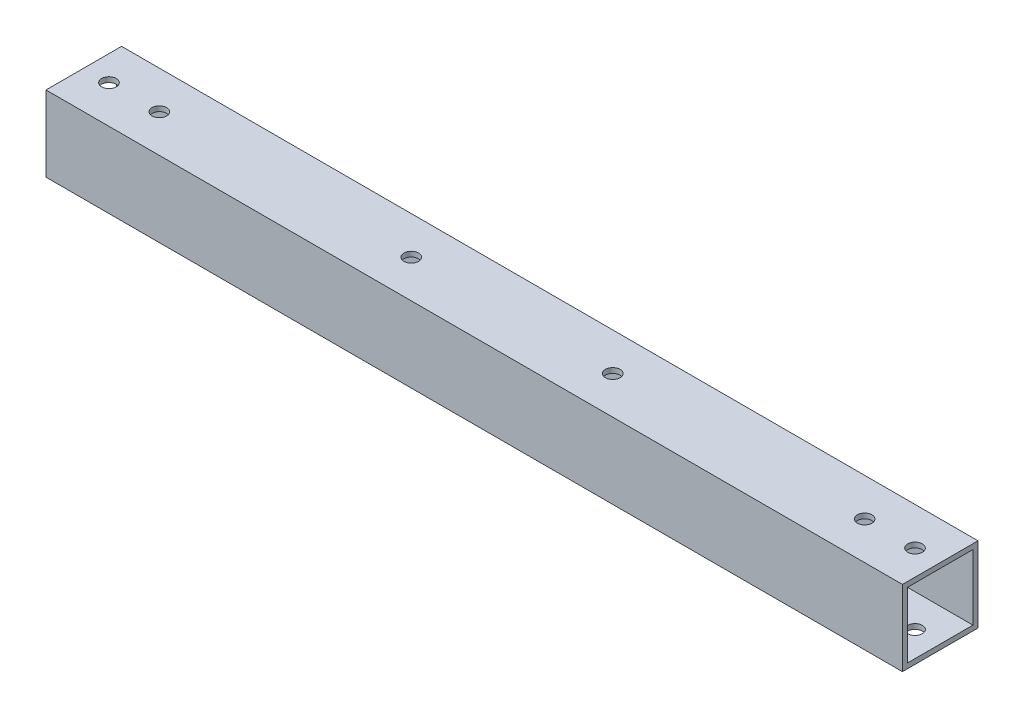
ISO-10303-21;
HEADER;
FILE_DESCRIPTION(('STEP AP214'),'2;1');
FILE_NAME('part.step','',(''),(''),'','','');
FILE_SCHEMA(('AUTOMOTIVE_DESIGN { 1 0 10303 214 1 1 1 1 }'));
ENDSEC;
DATA;
#1=APPLICATION_CONTEXT('core data for automotive mechanical design processes');
#2=APPLICATION_PROTOCOL_DEFINITION('international standard','automotive_design',2000,#1);
#3=PRODUCT_CONTEXT('',#1,'mechanical');
#4=PRODUCT('Part','Part','',(#3));
#5=PRODUCT_RELATED_PRODUCT_CATEGORY('part','',(#4));
#6=PRODUCT_DEFINITION_FORMATION('','',#4);
#7=PRODUCT_DEFINITION_CONTEXT('part definition',#1,'design');
#8=PRODUCT_DEFINITION('design','',#6,#7);
#9=PRODUCT_DEFINITION_SHAPE('','',#8);
#10=(LENGTH_UNIT() NAMED_UNIT(*) SI_UNIT(.MILLI.,.METRE.));
#11=(NAMED_UNIT(*) PLANE_ANGLE_UNIT() SI_UNIT($,.RADIAN.));
#12=(NAMED_UNIT(*) SI_UNIT($,.STERADIAN.) SOLID_ANGLE_UNIT());
#13=UNCERTAINTY_MEASURE_WITH_UNIT(LENGTH_MEASURE(1.E-05),#10,'distance_accuracy_value','');
#14=(GEOMETRIC_REPRESENTATION_CONTEXT(3) GLOBAL_UNCERTAINTY_ASSIGNED_CONTEXT((#13)) GLOBAL_UNIT_ASSIGNED_CONTEXT((#10,
#11,#12)) REPRESENTATION_CONTEXT('',''));
#15=CARTESIAN_POINT('',(0.,0.,0.));
#16=DIRECTION('',(0.,0.,1.));
#17=DIRECTION('',(1.,0.,0.));
#18=AXIS2_PLACEMENT_3D('',#15,#16,#17);
#19=CARTESIAN_POINT('',(85.,-6.50000000000001,-6.49999999999999));
#20=DIRECTION('',(0.,0.,1.));
#21=DIRECTION('',(1.,0.,0.));
#22=AXIS2_PLACEMENT_3D('',#19,#20,#21);
#23=PLANE('',#22);
#24=DIRECTION('',(0.,1.,0.));
#25=VECTOR('',#24,1.);
#26=CARTESIAN_POINT('',(-85.,-6.50000000000001,-6.49999999999999));
#27=LINE('',#26,#25);
#28=CARTESIAN_POINT('',(-85.,-6.50000000000001,-6.49999999999999));
#29=VERTEX_POINT('',#28);
#30=CARTESIAN_POINT('',(-85.,6.49999999999999,-6.49999999999999));
#31=VERTEX_POINT('',#30);
#32=EDGE_CURVE('E164',#29,#31,#27,.T.);
#33=ORIENTED_EDGE('',*,*,#32,.F.);
#34=DIRECTION('',(-1.,0.,0.));
#35=VECTOR('',#34,1.);
#36=CARTESIAN_POINT('',(85.,-6.50000000000001,-6.49999999999999));
#37=LINE('',#36,#35);
#38=CARTESIAN_POINT('',(85.,-6.50000000000001,-6.49999999999999));
#39=VERTEX_POINT('',#38);
#40=EDGE_CURVE('E12',#39,#29,#37,.T.);
#41=ORIENTED_EDGE('',*,*,#40,.F.);
#42=DIRECTION('',(0.,1.,0.));
#43=VECTOR('',#42,1.);
#44=CARTESIAN_POINT('',(85.,-6.50000000000001,-6.49999999999999));
#45=LINE('',#44,#43);
#46=CARTESIAN_POINT('',(85.,6.49999999999999,-6.49999999999999));
#47=VERTEX_POINT('',#46);
#48=EDGE_CURVE('E145',#39,#47,#45,.T.);
#49=ORIENTED_EDGE('',*,*,#48,.T.);
#50=DIRECTION('',(-1.,0.,0.));
#51=VECTOR('',#50,1.);
#52=CARTESIAN_POINT('',(85.,6.49999999999999,-6.49999999999999));
#53=LINE('',#52,#51);
#54=EDGE_CURVE('E76',#47,#31,#53,.T.);
#55=ORIENTED_EDGE('',*,*,#54,.T.);
#56=EDGE_LOOP('',(#33,#41,#49,#55));
#57=FACE_BOUND('',#56,.T.);
#58=ADVANCED_FACE('F57',(#57),#23,.T.);
#59=CARTESIAN_POINT('',(85.,-6.50000000000001,6.50000000000001));
#60=DIRECTION('',(0.,1.,0.));
#61=DIRECTION('',(0.,0.,1.));
#62=AXIS2_PLACEMENT_3D('',#59,#60,#61);
#63=PLANE('',#62);
#64=CARTESIAN_POINT('',(-20.,-6.50000000000001,0.));
#65=DIRECTION('',(0.,1.,0.));
#66=DIRECTION('',(0.,0.,1.));
#67=AXIS2_PLACEMENT_3D('',#64,#65,#66);
#68=CIRCLE('',#67,1.45);
#69=CARTESIAN_POINT('',(-20.,-6.50000000000001,1.45));
#70=VERTEX_POINT('',#69);
#71=EDGE_CURVE('E222',#70,#70,#68,.T.);
#72=ORIENTED_EDGE('',*,*,#71,.F.);
#73=EDGE_LOOP('',(#72));
#74=FACE_BOUND('',#73,.T.);
#75=CARTESIAN_POINT('',(20.,-6.50000000000001,0.));
#76=DIRECTION('',(0.,1.,0.));
#77=DIRECTION('',(0.,0.,1.));
#78=AXIS2_PLACEMENT_3D('',#75,#76,#77);
#79=CIRCLE('',#78,1.45);
#80=CARTESIAN_POINT('',(20.,-6.50000000000001,1.45));
#81=VERTEX_POINT('',#80);
#82=EDGE_CURVE('E202',#81,#81,#79,.T.);
#83=ORIENTED_EDGE('',*,*,#82,.F.);
#84=EDGE_LOOP('',(#83));
#85=FACE_BOUND('',#84,.T.);
#86=CARTESIAN_POINT('',(-80.,-6.50000000000001,0.));
#87=DIRECTION('',(0.,1.,0.));
#88=DIRECTION('',(0.,0.,1.));
#89=AXIS2_PLACEMENT_3D('',#86,#87,#88);
#90=CIRCLE('',#89,1.45);
#91=CARTESIAN_POINT('',(-80.,-6.50000000000001,1.45));
#92=VERTEX_POINT('',#91);
#93=EDGE_CURVE('E158',#92,#92,#90,.T.);
#94=ORIENTED_EDGE('',*,*,#93,.F.);
#95=EDGE_LOOP('',(#94));
#96=FACE_BOUND('',#95,.T.);
#97=CARTESIAN_POINT('',(-70.,-6.50000000000001,0.));
#98=DIRECTION('',(0.,1.,0.));
#99=DIRECTION('',(0.,0.,1.));
#100=AXIS2_PLACEMENT_3D('',#97,#98,#99);
#101=CIRCLE('',#100,1.45);
#102=CARTESIAN_POINT('',(-70.,-6.50000000000001,1.45));
#103=VERTEX_POINT('',#102);
#104=EDGE_CURVE('E197',#103,#103,#101,.T.);
#105=ORIENTED_EDGE('',*,*,#104,.F.);
#106=EDGE_LOOP('',(#105));
#107=FACE_BOUND('',#106,.T.);
#108=CARTESIAN_POINT('',(70.,-6.50000000000001,0.));
#109=DIRECTION('',(0.,1.,0.));
#110=DIRECTION('',(0.,0.,1.));
#111=AXIS2_PLACEMENT_3D('',#108,#109,#110);
#112=CIRCLE('',#111,1.45);
#113=CARTESIAN_POINT('',(70.,-6.50000000000001,1.44999999999998));
#114=VERTEX_POINT('',#113);
#115=EDGE_CURVE('E193',#114,#114,#112,.T.);
#116=ORIENTED_EDGE('',*,*,#115,.F.);
#117=EDGE_LOOP('',(#116));
#118=FACE_BOUND('',#117,.T.);
#119=CARTESIAN_POINT('',(80.,-6.50000000000001,0.));
#120=DIRECTION('',(0.,1.,0.));
#121=DIRECTION('',(0.,0.,1.));
#122=AXIS2_PLACEMENT_3D('',#119,#120,#121);
#123=CIRCLE('',#122,1.45);
#124=CARTESIAN_POINT('',(80.,-6.50000000000001,1.44999999999998));
#125=VERTEX_POINT('',#124);
#126=EDGE_CURVE('E188',#125,#125,#123,.T.);
#127=ORIENTED_EDGE('',*,*,#126,.F.);
#128=EDGE_LOOP('',(#127));
#129=FACE_BOUND('',#128,.T.);
#130=DIRECTION('',(0.,0.,-1.));
#131=VECTOR('',#130,1.);
#132=CARTESIAN_POINT('',(-85.,-6.50000000000001,6.50000000000001));
#133=LINE('',#132,#131);
#134=CARTESIAN_POINT('',(-85.,-6.50000000000001,6.50000000000001));
#135=VERTEX_POINT('',#134);
#136=EDGE_CURVE('E134',#135,#29,#133,.T.);
#137=ORIENTED_EDGE('',*,*,#136,.F.);
#138=DIRECTION('',(-1.,0.,0.));
#139=VECTOR('',#138,1.);
#140=CARTESIAN_POINT('',(85.,-6.50000000000001,6.50000000000001));
#141=LINE('',#140,#139);
#142=CARTESIAN_POINT('',(85.,-6.50000000000001,6.50000000000001));
#143=VERTEX_POINT('',#142);
#144=EDGE_CURVE('E67',#143,#135,#141,.T.);
#145=ORIENTED_EDGE('',*,*,#144,.F.);
#146=DIRECTION('',(0.,0.,-1.));
#147=VECTOR('',#146,1.);
#148=CARTESIAN_POINT('',(85.,-6.50000000000001,6.50000000000001));
#149=LINE('',#148,#147);
#150=EDGE_CURVE('E132',#143,#39,#149,.T.);
#151=ORIENTED_EDGE('',*,*,#150,.T.);
#152=ORIENTED_EDGE('',*,*,#40,.T.);
#153=EDGE_LOOP('',(#137,#145,#151,#152));
#154=FACE_BOUND('',#153,.T.);
#155=ADVANCED_FACE('F131',(#74,#85,#96,#107,#118,#129,#154),#63,.T.);
#156=CARTESIAN_POINT('',(85.,-6.50000000000001,6.50000000000001));
#157=DIRECTION('',(0.,0.,-1.));
#158=DIRECTION('',(-1.,0.,0.));
#159=AXIS2_PLACEMENT_3D('',#156,#157,#158);
#160=PLANE('',#159);
#161=DIRECTION('',(0.,-1.,0.));
#162=VECTOR('',#161,1.);
#163=CARTESIAN_POINT('',(-85.,-6.50000000000001,6.50000000000001));
#164=LINE('',#163,#162);
#165=CARTESIAN_POINT('',(-85.,6.49999999999999,6.50000000000001));
#166=VERTEX_POINT('',#165);
#167=EDGE_CURVE('E167',#166,#135,#164,.T.);
#168=ORIENTED_EDGE('',*,*,#167,.F.);
#169=DIRECTION('',(-1.,0.,0.));
#170=VECTOR('',#169,1.);
#171=CARTESIAN_POINT('',(85.,6.49999999999999,6.50000000000001));
#172=LINE('',#171,#170);
#173=CARTESIAN_POINT('',(85.,6.49999999999999,6.50000000000001));
#174=VERTEX_POINT('',#173);
#175=EDGE_CURVE('E101',#174,#166,#172,.T.);
#176=ORIENTED_EDGE('',*,*,#175,.F.);
#177=DIRECTION('',(0.,-1.,0.));
#178=VECTOR('',#177,1.);
#179=CARTESIAN_POINT('',(85.,-6.50000000000001,6.50000000000001));
#180=LINE('',#179,#178);
#181=EDGE_CURVE('E144',#174,#143,#180,.T.);
#182=ORIENTED_EDGE('',*,*,#181,.T.);
#183=ORIENTED_EDGE('',*,*,#144,.T.);
#184=EDGE_LOOP('',(#168,#176,#182,#183));
#185=FACE_BOUND('',#184,.T.);
#186=ADVANCED_FACE('F147',(#185),#160,.T.);
#187=CARTESIAN_POINT('',(85.,-7.50000000000001,-7.49999999999999));
#188=DIRECTION('',(0.,0.,1.));
#189=DIRECTION('',(1.,0.,0.));
#190=AXIS2_PLACEMENT_3D('',#187,#188,#189);
#191=PLANE('',#190);
#192=DIRECTION('',(0.,1.,0.));
#193=VECTOR('',#192,1.);
#194=CARTESIAN_POINT('',(-85.,-7.50000000000001,-7.49999999999999));
#195=LINE('',#194,#193);
#196=CARTESIAN_POINT('',(-85.,-7.50000000000001,-7.49999999999999));
#197=VERTEX_POINT('',#196);
#198=CARTESIAN_POINT('',(-85.,7.49999999999999,-7.49999999999999));
#199=VERTEX_POINT('',#198);
#200=EDGE_CURVE('E154',#197,#199,#195,.T.);
#201=ORIENTED_EDGE('',*,*,#200,.T.);
#202=DIRECTION('',(-1.,0.,0.));
#203=VECTOR('',#202,1.);
#204=CARTESIAN_POINT('',(85.,7.49999999999999,-7.49999999999999));
#205=LINE('',#204,#203);
#206=CARTESIAN_POINT('',(85.,7.49999999999999,-7.49999999999999));
#207=VERTEX_POINT('',#206);
#208=EDGE_CURVE('E174',#207,#199,#205,.T.);
#209=ORIENTED_EDGE('',*,*,#208,.F.);
#210=DIRECTION('',(0.,1.,0.));
#211=VECTOR('',#210,1.);
#212=CARTESIAN_POINT('',(85.,-7.50000000000001,-7.49999999999999));
#213=LINE('',#212,#211);
#214=CARTESIAN_POINT('',(85.,-7.50000000000001,-7.49999999999999));
#215=VERTEX_POINT('',#214);
#216=EDGE_CURVE('E172',#215,#207,#213,.T.);
#217=ORIENTED_EDGE('',*,*,#216,.F.);
#218=DIRECTION('',(-1.,0.,0.));
#219=VECTOR('',#218,1.);
#220=CARTESIAN_POINT('',(85.,-7.50000000000001,-7.49999999999999));
#221=LINE('',#220,#219);
#222=EDGE_CURVE('E150',#215,#197,#221,.T.);
#223=ORIENTED_EDGE('',*,*,#222,.T.);
#224=EDGE_LOOP('',(#201,#209,#217,#223));
#225=FACE_BOUND('',#224,.T.);
#226=ADVANCED_FACE('F59',(#225),#191,.F.);
#227=CARTESIAN_POINT('',(85.,7.49999999999999,7.50000000000001));
#228=DIRECTION('',(0.,-1.,0.));
#229=DIRECTION('',(0.,0.,-1.));
#230=AXIS2_PLACEMENT_3D('',#227,#228,#229);
#231=PLANE('',#230);
#232=CARTESIAN_POINT('',(-20.,7.49999999999999,0.));
#233=DIRECTION('',(0.,1.,0.));
#234=DIRECTION('',(0.,0.,1.));
#235=AXIS2_PLACEMENT_3D('',#232,#233,#234);
#236=CIRCLE('',#235,1.45);
#237=CARTESIAN_POINT('',(-20.,7.49999999999999,1.45));
#238=VERTEX_POINT('',#237);
#239=EDGE_CURVE('E209',#238,#238,#236,.T.);
#240=ORIENTED_EDGE('',*,*,#239,.F.);
#241=EDGE_LOOP('',(#240));
#242=FACE_BOUND('',#241,.T.);
#243=CARTESIAN_POINT('',(20.,7.49999999999999,0.));
#244=DIRECTION('',(0.,1.,0.));
#245=DIRECTION('',(0.,0.,1.));
#246=AXIS2_PLACEMENT_3D('',#243,#244,#245);
#247=CIRCLE('',#246,1.45);
#248=CARTESIAN_POINT('',(20.,7.49999999999999,1.45));
#249=VERTEX_POINT('',#248);
#250=EDGE_CURVE('E214',#249,#249,#247,.T.);
#251=ORIENTED_EDGE('',*,*,#250,.F.);
#252=EDGE_LOOP('',(#251));
#253=FACE_BOUND('',#252,.T.);
#254=CARTESIAN_POINT('',(-80.,7.49999999999999,0.));
#255=DIRECTION('',(0.,1.,0.));
#256=DIRECTION('',(0.,0.,1.));
#257=AXIS2_PLACEMENT_3D('',#254,#255,#256);
#258=CIRCLE('',#257,1.45);
#259=CARTESIAN_POINT('',(-80.,7.49999999999999,1.45));
#260=VERTEX_POINT('',#259);
#261=EDGE_CURVE('E228',#260,#260,#258,.T.);
#262=ORIENTED_EDGE('',*,*,#261,.F.);
#263=EDGE_LOOP('',(#262));
#264=FACE_BOUND('',#263,.T.);
#265=CARTESIAN_POINT('',(-70.,7.49999999999999,0.));
#266=DIRECTION('',(0.,1.,0.));
#267=DIRECTION('',(0.,0.,1.));
#268=AXIS2_PLACEMENT_3D('',#265,#266,#267);
#269=CIRCLE('',#268,1.45);
#270=CARTESIAN_POINT('',(-70.,7.49999999999999,1.45));
#271=VERTEX_POINT('',#270);
#272=EDGE_CURVE('E231',#271,#271,#269,.T.);
#273=ORIENTED_EDGE('',*,*,#272,.F.);
#274=EDGE_LOOP('',(#273));
#275=FACE_BOUND('',#274,.T.);
#276=CARTESIAN_POINT('',(70.,7.49999999999999,0.));
#277=DIRECTION('',(0.,1.,0.));
#278=DIRECTION('',(0.,0.,-1.));
#279=AXIS2_PLACEMENT_3D('',#276,#277,#278);
#280=CIRCLE('',#279,1.45);
#281=CARTESIAN_POINT('',(70.,7.49999999999999,-1.45000000000002));
#282=VERTEX_POINT('',#281);
#283=EDGE_CURVE('E237',#282,#282,#280,.T.);
#284=ORIENTED_EDGE('',*,*,#283,.F.);
#285=EDGE_LOOP('',(#284));
#286=FACE_BOUND('',#285,.T.);
#287=CARTESIAN_POINT('',(80.,7.49999999999999,0.));
#288=DIRECTION('',(0.,1.,0.));
#289=DIRECTION('',(0.,0.,-1.));
#290=AXIS2_PLACEMENT_3D('',#287,#288,#289);
#291=CIRCLE('',#290,1.45);
#292=CARTESIAN_POINT('',(80.,7.49999999999999,-1.45000000000002));
#293=VERTEX_POINT('',#292);
#294=EDGE_CURVE('E243',#293,#293,#291,.T.);
#295=ORIENTED_EDGE('',*,*,#294,.F.);
#296=EDGE_LOOP('',(#295));
#297=FACE_BOUND('',#296,.T.);
#298=DIRECTION('',(0.,0.,1.));
#299=VECTOR('',#298,1.);
#300=CARTESIAN_POINT('',(-85.,7.49999999999999,7.50000000000001));
#301=LINE('',#300,#299);
#302=CARTESIAN_POINT('',(-85.,7.49999999999999,7.50000000000001));
#303=VERTEX_POINT('',#302);
#304=EDGE_CURVE('E157',#199,#303,#301,.T.);
#305=ORIENTED_EDGE('',*,*,#304,.T.);
#306=DIRECTION('',(-1.,0.,0.));
#307=VECTOR('',#306,1.);
#308=CARTESIAN_POINT('',(85.,7.49999999999999,7.50000000000001));
#309=LINE('',#308,#307);
#310=CARTESIAN_POINT('',(85.,7.49999999999999,7.50000000000001));
#311=VERTEX_POINT('',#310);
#312=EDGE_CURVE('E181',#311,#303,#309,.T.);
#313=ORIENTED_EDGE('',*,*,#312,.F.);
#314=DIRECTION('',(0.,0.,1.));
#315=VECTOR('',#314,1.);
#316=CARTESIAN_POINT('',(85.,7.49999999999999,7.50000000000001));
#317=LINE('',#316,#315);
#318=EDGE_CURVE('E114',#207,#311,#317,.T.);
#319=ORIENTED_EDGE('',*,*,#318,.F.);
#320=ORIENTED_EDGE('',*,*,#208,.T.);
#321=EDGE_LOOP('',(#305,#313,#319,#320));
#322=FACE_BOUND('',#321,.T.);
#323=ADVANCED_FACE('F290',(#242,#253,#264,#275,#286,#297,#322),#231,.F.);
#324=CARTESIAN_POINT('',(85.,-7.50000000000001,7.49999999999999));
#325=DIRECTION('',(0.,0.,-1.));
#326=DIRECTION('',(0.,1.,0.));
#327=AXIS2_PLACEMENT_3D('',#324,#325,#326);
#328=PLANE('',#327);
#329=DIRECTION('',(0.,-1.,0.));
#330=VECTOR('',#329,1.);
#331=CARTESIAN_POINT('',(-85.,-7.50000000000001,7.49999999999999));
#332=LINE('',#331,#330);
#333=CARTESIAN_POINT('',(-85.,-7.50000000000001,7.49999999999999));
#334=VERTEX_POINT('',#333);
#335=EDGE_CURVE('E160',#303,#334,#332,.T.);
#336=ORIENTED_EDGE('',*,*,#335,.T.);
#337=DIRECTION('',(-1.,0.,0.));
#338=VECTOR('',#337,1.);
#339=CARTESIAN_POINT('',(85.,-7.50000000000001,7.49999999999999));
#340=LINE('',#339,#338);
#341=CARTESIAN_POINT('',(85.,-7.50000000000001,7.49999999999999));
#342=VERTEX_POINT('',#341);
#343=EDGE_CURVE('E178',#342,#334,#340,.T.);
#344=ORIENTED_EDGE('',*,*,#343,.F.);
#345=DIRECTION('',(0.,-1.,0.));
#346=VECTOR('',#345,1.);
#347=CARTESIAN_POINT('',(85.,-7.50000000000001,7.49999999999999));
#348=LINE('',#347,#346);
#349=EDGE_CURVE('E258',#311,#342,#348,.T.);
#350=ORIENTED_EDGE('',*,*,#349,.F.);
#351=ORIENTED_EDGE('',*,*,#312,.T.);
#352=EDGE_LOOP('',(#336,#344,#350,#351));
#353=FACE_BOUND('',#352,.T.);
#354=ADVANCED_FACE('F274',(#353),#328,.F.);
#355=CARTESIAN_POINT('',(85.,-7.50000000000001,7.49999999999999));
#356=DIRECTION('',(0.,1.,0.));
#357=DIRECTION('',(0.,0.,1.));
#358=AXIS2_PLACEMENT_3D('',#355,#356,#357);
#359=PLANE('',#358);
#360=CARTESIAN_POINT('',(-20.,-7.50000000000001,0.));
#361=DIRECTION('',(0.,1.,0.));
#362=DIRECTION('',(0.,0.,1.));
#363=AXIS2_PLACEMENT_3D('',#360,#361,#362);
#364=CIRCLE('',#363,1.45);
#365=CARTESIAN_POINT('',(-20.,-7.50000000000001,1.45));
#366=VERTEX_POINT('',#365);
#367=EDGE_CURVE('E203',#366,#366,#364,.T.);
#368=ORIENTED_EDGE('',*,*,#367,.T.);
#369=EDGE_LOOP('',(#368));
#370=FACE_BOUND('',#369,.T.);
#371=CARTESIAN_POINT('',(20.,-7.50000000000001,0.));
#372=DIRECTION('',(0.,1.,0.));
#373=DIRECTION('',(0.,0.,1.));
#374=AXIS2_PLACEMENT_3D('',#371,#372,#373);
#375=CIRCLE('',#374,1.45);
#376=CARTESIAN_POINT('',(20.,-7.50000000000001,1.45));
#377=VERTEX_POINT('',#376);
#378=EDGE_CURVE('E219',#377,#377,#375,.T.);
#379=ORIENTED_EDGE('',*,*,#378,.T.);
#380=EDGE_LOOP('',(#379));
#381=FACE_BOUND('',#380,.T.);
#382=CARTESIAN_POINT('',(-80.,-7.50000000000001,0.));
#383=DIRECTION('',(0.,1.,0.));
#384=DIRECTION('',(0.,0.,1.));
#385=AXIS2_PLACEMENT_3D('',#382,#383,#384);
#386=CIRCLE('',#385,1.45);
#387=CARTESIAN_POINT('',(-80.,-7.50000000000001,1.45));
#388=VERTEX_POINT('',#387);
#389=EDGE_CURVE('E189',#388,#388,#386,.T.);
#390=ORIENTED_EDGE('',*,*,#389,.T.);
#391=EDGE_LOOP('',(#390));
#392=FACE_BOUND('',#391,.T.);
#393=CARTESIAN_POINT('',(-70.,-7.50000000000001,0.));
#394=DIRECTION('',(0.,1.,0.));
#395=DIRECTION('',(0.,0.,1.));
#396=AXIS2_PLACEMENT_3D('',#393,#394,#395);
#397=CIRCLE('',#396,1.45);
#398=CARTESIAN_POINT('',(-70.,-7.50000000000001,1.45));
#399=VERTEX_POINT('',#398);
#400=EDGE_CURVE('E234',#399,#399,#397,.T.);
#401=ORIENTED_EDGE('',*,*,#400,.T.);
#402=EDGE_LOOP('',(#401));
#403=FACE_BOUND('',#402,.T.);
#404=CARTESIAN_POINT('',(70.,-7.50000000000001,0.));
#405=DIRECTION('',(0.,1.,0.));
#406=DIRECTION('',(0.,0.,-1.));
#407=AXIS2_PLACEMENT_3D('',#404,#405,#406);
#408=CIRCLE('',#407,1.45);
#409=CARTESIAN_POINT('',(70.,-7.50000000000001,-1.45000000000002));
#410=VERTEX_POINT('',#409);
#411=EDGE_CURVE('E240',#410,#410,#408,.T.);
#412=ORIENTED_EDGE('',*,*,#411,.T.);
#413=EDGE_LOOP('',(#412));
#414=FACE_BOUND('',#413,.T.);
#415=CARTESIAN_POINT('',(80.,-7.50000000000001,0.));
#416=DIRECTION('',(0.,1.,0.));
#417=DIRECTION('',(0.,0.,-1.));
#418=AXIS2_PLACEMENT_3D('',#415,#416,#417);
#419=CIRCLE('',#418,1.45);
#420=CARTESIAN_POINT('',(80.,-7.50000000000001,-1.45000000000002));
#421=VERTEX_POINT('',#420);
#422=EDGE_CURVE('E225',#421,#421,#419,.T.);
#423=ORIENTED_EDGE('',*,*,#422,.T.);
#424=EDGE_LOOP('',(#423));
#425=FACE_BOUND('',#424,.T.);
#426=DIRECTION('',(0.,0.,-1.));
#427=VECTOR('',#426,1.);
#428=CARTESIAN_POINT('',(-85.,-7.50000000000001,7.49999999999999));
#429=LINE('',#428,#427);
#430=EDGE_CURVE('E162',#334,#197,#429,.T.);
#431=ORIENTED_EDGE('',*,*,#430,.T.);
#432=ORIENTED_EDGE('',*,*,#222,.F.);
#433=DIRECTION('',(0.,0.,-1.));
#434=VECTOR('',#433,1.);
#435=CARTESIAN_POINT('',(85.,-7.50000000000001,7.49999999999999));
#436=LINE('',#435,#434);
#437=EDGE_CURVE('E260',#342,#215,#436,.T.);
#438=ORIENTED_EDGE('',*,*,#437,.F.);
#439=ORIENTED_EDGE('',*,*,#343,.T.);
#440=EDGE_LOOP('',(#431,#432,#438,#439));
#441=FACE_BOUND('',#440,.T.);
#442=ADVANCED_FACE('F263',(#370,#381,#392,#403,#414,#425,#441),#359,.F.);
#443=CARTESIAN_POINT('',(85.,6.49999999999999,6.50000000000001));
#444=DIRECTION('',(0.,-1.,0.));
#445=DIRECTION('',(0.,0.,-1.));
#446=AXIS2_PLACEMENT_3D('',#443,#444,#445);
#447=PLANE('',#446);
#448=CARTESIAN_POINT('',(-20.,6.49999999999999,0.));
#449=DIRECTION('',(0.,-1.,0.));
#450=DIRECTION('',(0.,0.,-1.));
#451=AXIS2_PLACEMENT_3D('',#448,#449,#450);
#452=CIRCLE('',#451,1.45);
#453=CARTESIAN_POINT('',(-20.,6.49999999999999,-1.45));
#454=VERTEX_POINT('',#453);
#455=EDGE_CURVE('E61',#454,#454,#452,.T.);
#456=ORIENTED_EDGE('',*,*,#455,.F.);
#457=EDGE_LOOP('',(#456));
#458=FACE_BOUND('',#457,.T.);
#459=CARTESIAN_POINT('',(20.,6.49999999999999,0.));
#460=DIRECTION('',(0.,-1.,0.));
#461=DIRECTION('',(0.,0.,-1.));
#462=AXIS2_PLACEMENT_3D('',#459,#460,#461);
#463=CIRCLE('',#462,1.45);
#464=CARTESIAN_POINT('',(20.,6.49999999999999,-1.45));
#465=VERTEX_POINT('',#464);
#466=EDGE_CURVE('E200',#465,#465,#463,.T.);
#467=ORIENTED_EDGE('',*,*,#466,.F.);
#468=EDGE_LOOP('',(#467));
#469=FACE_BOUND('',#468,.T.);
#470=CARTESIAN_POINT('',(-80.,6.49999999999999,0.));
#471=DIRECTION('',(0.,-1.,0.));
#472=DIRECTION('',(0.,0.,-1.));
#473=AXIS2_PLACEMENT_3D('',#470,#471,#472);
#474=CIRCLE('',#473,1.45);
#475=CARTESIAN_POINT('',(-80.,6.49999999999999,-1.45));
#476=VERTEX_POINT('',#475);
#477=EDGE_CURVE('E198',#476,#476,#474,.T.);
#478=ORIENTED_EDGE('',*,*,#477,.F.);
#479=EDGE_LOOP('',(#478));
#480=FACE_BOUND('',#479,.T.);
#481=CARTESIAN_POINT('',(-70.,6.49999999999999,0.));
#482=DIRECTION('',(0.,-1.,0.));
#483=DIRECTION('',(0.,0.,-1.));
#484=AXIS2_PLACEMENT_3D('',#481,#482,#483);
#485=CIRCLE('',#484,1.45);
#486=CARTESIAN_POINT('',(-70.,6.49999999999999,-1.45));
#487=VERTEX_POINT('',#486);
#488=EDGE_CURVE('E194',#487,#487,#485,.T.);
#489=ORIENTED_EDGE('',*,*,#488,.F.);
#490=EDGE_LOOP('',(#489));
#491=FACE_BOUND('',#490,.T.);
#492=CARTESIAN_POINT('',(70.,6.49999999999999,0.));
#493=DIRECTION('',(0.,-1.,0.));
#494=DIRECTION('',(0.,0.,-1.));
#495=AXIS2_PLACEMENT_3D('',#492,#493,#494);
#496=CIRCLE('',#495,1.45);
#497=CARTESIAN_POINT('',(70.,6.49999999999999,-1.45000000000002));
#498=VERTEX_POINT('',#497);
#499=EDGE_CURVE('E190',#498,#498,#496,.T.);
#500=ORIENTED_EDGE('',*,*,#499,.F.);
#501=EDGE_LOOP('',(#500));
#502=FACE_BOUND('',#501,.T.);
#503=CARTESIAN_POINT('',(80.,6.49999999999999,0.));
#504=DIRECTION('',(0.,-1.,0.));
#505=DIRECTION('',(0.,0.,-1.));
#506=AXIS2_PLACEMENT_3D('',#503,#504,#505);
#507=CIRCLE('',#506,1.45);
#508=CARTESIAN_POINT('',(80.,6.49999999999999,-1.45000000000002));
#509=VERTEX_POINT('',#508);
#510=EDGE_CURVE('E185',#509,#509,#507,.T.);
#511=ORIENTED_EDGE('',*,*,#510,.F.);
#512=EDGE_LOOP('',(#511));
#513=FACE_BOUND('',#512,.T.);
#514=DIRECTION('',(0.,0.,1.));
#515=VECTOR('',#514,1.);
#516=CARTESIAN_POINT('',(-85.,6.49999999999999,6.50000000000001));
#517=LINE('',#516,#515);
#518=EDGE_CURVE('E169',#31,#166,#517,.T.);
#519=ORIENTED_EDGE('',*,*,#518,.F.);
#520=ORIENTED_EDGE('',*,*,#54,.F.);
#521=DIRECTION('',(0.,0.,1.));
#522=VECTOR('',#521,1.);
#523=CARTESIAN_POINT('',(85.,6.49999999999999,6.50000000000001));
#524=LINE('',#523,#522);
#525=EDGE_CURVE('E148',#47,#174,#524,.T.);
#526=ORIENTED_EDGE('',*,*,#525,.T.);
#527=ORIENTED_EDGE('',*,*,#175,.T.);
#528=EDGE_LOOP('',(#519,#520,#526,#527));
#529=FACE_BOUND('',#528,.T.);
#530=ADVANCED_FACE('F261',(#458,#469,#480,#491,#502,#513,#529),#447,.T.);
#531=CARTESIAN_POINT('',(85.,0.,0.));
#532=DIRECTION('',(-1.,0.,0.));
#533=DIRECTION('',(0.,0.,1.));
#534=AXIS2_PLACEMENT_3D('',#531,#532,#533);
#535=PLANE('',#534);
#536=ORIENTED_EDGE('',*,*,#216,.T.);
#537=ORIENTED_EDGE('',*,*,#318,.T.);
#538=ORIENTED_EDGE('',*,*,#349,.T.);
#539=ORIENTED_EDGE('',*,*,#437,.T.);
#540=EDGE_LOOP('',(#536,#537,#538,#539));
#541=FACE_BOUND('',#540,.T.);
#542=ORIENTED_EDGE('',*,*,#48,.F.);
#543=ORIENTED_EDGE('',*,*,#150,.F.);
#544=ORIENTED_EDGE('',*,*,#181,.F.);
#545=ORIENTED_EDGE('',*,*,#525,.F.);
#546=EDGE_LOOP('',(#542,#543,#544,#545));
#547=FACE_BOUND('',#546,.T.);
#548=ADVANCED_FACE('F142',(#541,#547),#535,.F.);
#549=CARTESIAN_POINT('',(-85.,0.,0.));
#550=DIRECTION('',(-1.,0.,0.));
#551=DIRECTION('',(0.,0.,1.));
#552=AXIS2_PLACEMENT_3D('',#549,#550,#551);
#553=PLANE('',#552);
#554=ORIENTED_EDGE('',*,*,#200,.F.);
#555=ORIENTED_EDGE('',*,*,#430,.F.);
#556=ORIENTED_EDGE('',*,*,#335,.F.);
#557=ORIENTED_EDGE('',*,*,#304,.F.);
#558=EDGE_LOOP('',(#554,#555,#556,#557));
#559=FACE_BOUND('',#558,.T.);
#560=ORIENTED_EDGE('',*,*,#32,.T.);
#561=ORIENTED_EDGE('',*,*,#518,.T.);
#562=ORIENTED_EDGE('',*,*,#167,.T.);
#563=ORIENTED_EDGE('',*,*,#136,.T.);
#564=EDGE_LOOP('',(#560,#561,#562,#563));
#565=FACE_BOUND('',#564,.T.);
#566=ADVANCED_FACE('F271',(#559,#565),#553,.T.);
#567=CARTESIAN_POINT('',(80.,-7.50000000000001,0.));
#568=DIRECTION('',(0.,1.,0.));
#569=DIRECTION('',(0.,0.,1.));
#570=AXIS2_PLACEMENT_3D('',#567,#568,#569);
#571=CYLINDRICAL_SURFACE('',#570,1.45);
#572=ORIENTED_EDGE('',*,*,#510,.T.);
#573=EDGE_LOOP('',(#572));
#574=FACE_BOUND('',#573,.T.);
#575=ORIENTED_EDGE('',*,*,#294,.T.);
#576=EDGE_LOOP('',(#575));
#577=FACE_BOUND('',#576,.T.);
#578=ADVANCED_FACE('F322',(#574,#577),#571,.F.);
#579=CARTESIAN_POINT('',(70.,-7.50000000000001,0.));
#580=DIRECTION('',(0.,1.,0.));
#581=DIRECTION('',(0.,0.,1.));
#582=AXIS2_PLACEMENT_3D('',#579,#580,#581);
#583=CYLINDRICAL_SURFACE('',#582,1.45);
#584=ORIENTED_EDGE('',*,*,#499,.T.);
#585=EDGE_LOOP('',(#584));
#586=FACE_BOUND('',#585,.T.);
#587=ORIENTED_EDGE('',*,*,#283,.T.);
#588=EDGE_LOOP('',(#587));
#589=FACE_BOUND('',#588,.T.);
#590=ADVANCED_FACE('F326',(#586,#589),#583,.F.);
#591=CARTESIAN_POINT('',(-70.,-7.50000000000001,0.));
#592=DIRECTION('',(0.,1.,0.));
#593=DIRECTION('',(0.,0.,1.));
#594=AXIS2_PLACEMENT_3D('',#591,#592,#593);
#595=CYLINDRICAL_SURFACE('',#594,1.45);
#596=ORIENTED_EDGE('',*,*,#488,.T.);
#597=EDGE_LOOP('',(#596));
#598=FACE_BOUND('',#597,.T.);
#599=ORIENTED_EDGE('',*,*,#272,.T.);
#600=EDGE_LOOP('',(#599));
#601=FACE_BOUND('',#600,.T.);
#602=ADVANCED_FACE('F333',(#598,#601),#595,.F.);
#603=CARTESIAN_POINT('',(-80.,-7.50000000000001,0.));
#604=DIRECTION('',(0.,1.,0.));
#605=DIRECTION('',(0.,0.,1.));
#606=AXIS2_PLACEMENT_3D('',#603,#604,#605);
#607=CYLINDRICAL_SURFACE('',#606,1.45);
#608=ORIENTED_EDGE('',*,*,#477,.T.);
#609=EDGE_LOOP('',(#608));
#610=FACE_BOUND('',#609,.T.);
#611=ORIENTED_EDGE('',*,*,#261,.T.);
#612=EDGE_LOOP('',(#611));
#613=FACE_BOUND('',#612,.T.);
#614=ADVANCED_FACE('F338',(#610,#613),#607,.F.);
#615=ORIENTED_EDGE('',*,*,#126,.T.);
#616=EDGE_LOOP('',(#615));
#617=FACE_BOUND('',#616,.T.);
#618=ORIENTED_EDGE('',*,*,#422,.F.);
#619=EDGE_LOOP('',(#618));
#620=FACE_BOUND('',#619,.T.);
#621=ADVANCED_FACE('F329',(#617,#620),#571,.F.);
#622=ORIENTED_EDGE('',*,*,#115,.T.);
#623=EDGE_LOOP('',(#622));
#624=FACE_BOUND('',#623,.T.);
#625=ORIENTED_EDGE('',*,*,#411,.F.);
#626=EDGE_LOOP('',(#625));
#627=FACE_BOUND('',#626,.T.);
#628=ADVANCED_FACE('F335',(#624,#627),#583,.F.);
#629=ORIENTED_EDGE('',*,*,#104,.T.);
#630=EDGE_LOOP('',(#629));
#631=FACE_BOUND('',#630,.T.);
#632=ORIENTED_EDGE('',*,*,#400,.F.);
#633=EDGE_LOOP('',(#632));
#634=FACE_BOUND('',#633,.T.);
#635=ADVANCED_FACE('F340',(#631,#634),#595,.F.);
#636=ORIENTED_EDGE('',*,*,#93,.T.);
#637=EDGE_LOOP('',(#636));
#638=FACE_BOUND('',#637,.T.);
#639=ORIENTED_EDGE('',*,*,#389,.F.);
#640=EDGE_LOOP('',(#639));
#641=FACE_BOUND('',#640,.T.);
#642=ADVANCED_FACE('F344',(#638,#641),#607,.F.);
#643=CARTESIAN_POINT('',(20.,-7.50000000000001,0.));
#644=DIRECTION('',(0.,1.,0.));
#645=DIRECTION('',(0.,0.,1.));
#646=AXIS2_PLACEMENT_3D('',#643,#644,#645);
#647=CYLINDRICAL_SURFACE('',#646,1.45);
#648=ORIENTED_EDGE('',*,*,#466,.T.);
#649=EDGE_LOOP('',(#648));
#650=FACE_BOUND('',#649,.T.);
#651=ORIENTED_EDGE('',*,*,#250,.T.);
#652=EDGE_LOOP('',(#651));
#653=FACE_BOUND('',#652,.T.);
#654=ADVANCED_FACE('F345',(#650,#653),#647,.F.);
#655=CARTESIAN_POINT('',(-20.,-7.50000000000001,0.));
#656=DIRECTION('',(0.,1.,0.));
#657=DIRECTION('',(0.,0.,1.));
#658=AXIS2_PLACEMENT_3D('',#655,#656,#657);
#659=CYLINDRICAL_SURFACE('',#658,1.45);
#660=ORIENTED_EDGE('',*,*,#455,.T.);
#661=EDGE_LOOP('',(#660));
#662=FACE_BOUND('',#661,.T.);
#663=ORIENTED_EDGE('',*,*,#239,.T.);
#664=EDGE_LOOP('',(#663));
#665=FACE_BOUND('',#664,.T.);
#666=ADVANCED_FACE('F347',(#662,#665),#659,.F.);
#667=ORIENTED_EDGE('',*,*,#82,.T.);
#668=EDGE_LOOP('',(#667));
#669=FACE_BOUND('',#668,.T.);
#670=ORIENTED_EDGE('',*,*,#378,.F.);
#671=EDGE_LOOP('',(#670));
#672=FACE_BOUND('',#671,.T.);
#673=ADVANCED_FACE('F348',(#669,#672),#647,.F.);
#674=ORIENTED_EDGE('',*,*,#71,.T.);
#675=EDGE_LOOP('',(#674));
#676=FACE_BOUND('',#675,.T.);
#677=ORIENTED_EDGE('',*,*,#367,.F.);
#678=EDGE_LOOP('',(#677));
#679=FACE_BOUND('',#678,.T.);
#680=ADVANCED_FACE('F351',(#676,#679),#659,.F.);
#681=CLOSED_SHELL('',(#58,#155,#186,#226,#323,#354,#442,#530,#548,#566,#578,#590,#602,#614,#621,
#628,#635,#642,#654,#666,#673,#680));
#682=MANIFOLD_SOLID_BREP('B2',#681);
#683=ADVANCED_BREP_SHAPE_REPRESENTATION('',(#18,#682),#14);
#684=SHAPE_DEFINITION_REPRESENTATION(#9,#683);
ENDSEC;
END-ISO-10303-21;
